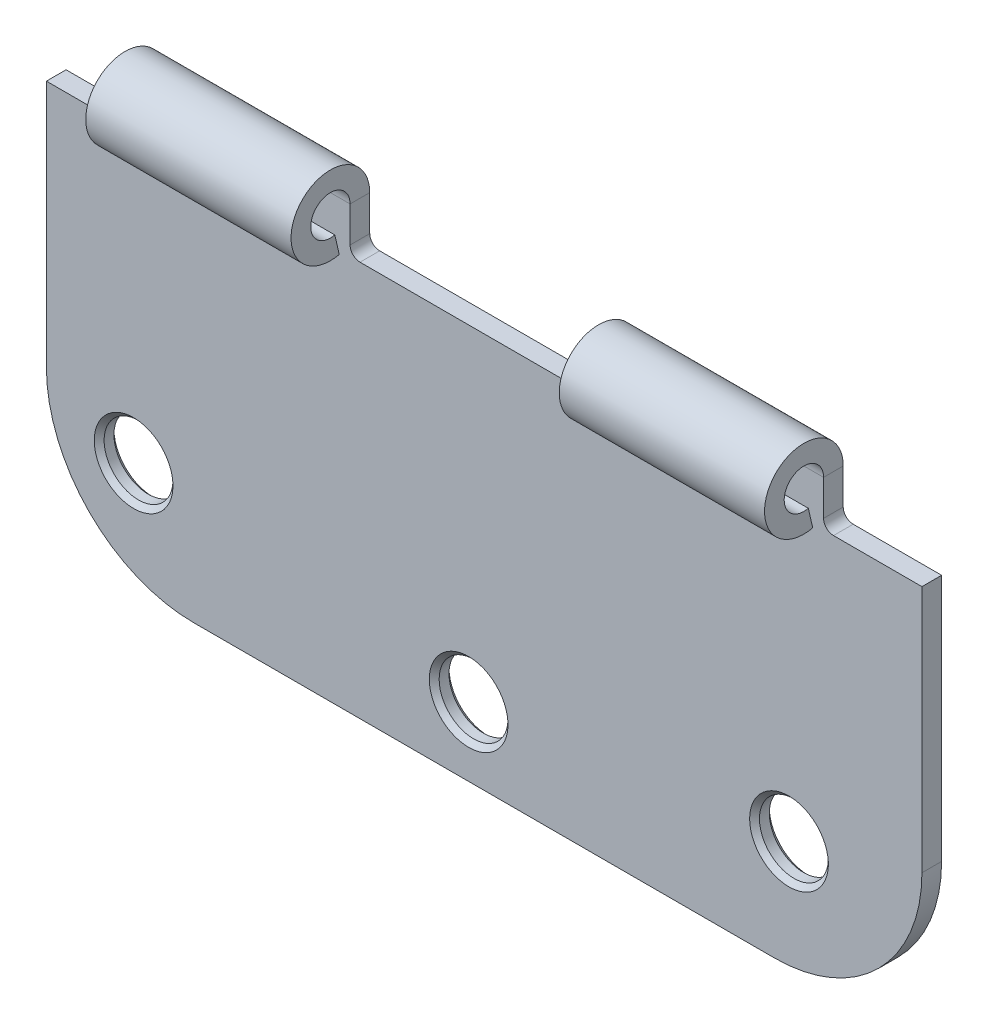
ISO-10303-21;
HEADER;
FILE_DESCRIPTION(('STEP AP214'),'2;1');
FILE_NAME('part.step','',(''),(''),'','','');
FILE_SCHEMA(('AUTOMOTIVE_DESIGN { 1 0 10303 214 1 1 1 1 }'));
ENDSEC;
DATA;
#1=APPLICATION_CONTEXT('core data for automotive mechanical design processes');
#2=APPLICATION_PROTOCOL_DEFINITION('international standard','automotive_design',2000,#1);
#3=PRODUCT_CONTEXT('',#1,'mechanical');
#4=PRODUCT('Part','Part','',(#3));
#5=PRODUCT_RELATED_PRODUCT_CATEGORY('part','',(#4));
#6=PRODUCT_DEFINITION_FORMATION('','',#4);
#7=PRODUCT_DEFINITION_CONTEXT('part definition',#1,'design');
#8=PRODUCT_DEFINITION('design','',#6,#7);
#9=PRODUCT_DEFINITION_SHAPE('','',#8);
#10=(LENGTH_UNIT() NAMED_UNIT(*) SI_UNIT(.MILLI.,.METRE.));
#11=(NAMED_UNIT(*) PLANE_ANGLE_UNIT() SI_UNIT($,.RADIAN.));
#12=(NAMED_UNIT(*) SI_UNIT($,.STERADIAN.) SOLID_ANGLE_UNIT());
#13=UNCERTAINTY_MEASURE_WITH_UNIT(LENGTH_MEASURE(1.E-05),#10,'distance_accuracy_value','');
#14=(GEOMETRIC_REPRESENTATION_CONTEXT(3) GLOBAL_UNCERTAINTY_ASSIGNED_CONTEXT((#13)) GLOBAL_UNIT_ASSIGNED_CONTEXT((#10,
#11,#12)) REPRESENTATION_CONTEXT('',''));
#15=CARTESIAN_POINT('',(0.,0.,0.));
#16=DIRECTION('',(0.,0.,1.));
#17=DIRECTION('',(1.,0.,0.));
#18=AXIS2_PLACEMENT_3D('',#15,#16,#17);
#19=CARTESIAN_POINT('',(58.13069714124,48.81,2.));
#20=DIRECTION('',(1.,0.,0.));
#21=DIRECTION('',(0.,-1.,0.));
#22=AXIS2_PLACEMENT_3D('',#19,#20,#21);
#23=PLANE('',#22);
#24=DIRECTION('',(0.,1.,0.));
#25=VECTOR('',#24,1.);
#26=CARTESIAN_POINT('',(58.13069714124,0.,0.));
#27=LINE('',#26,#25);
#28=CARTESIAN_POINT('',(58.13069714124,44.81,0.));
#29=VERTEX_POINT('',#28);
#30=CARTESIAN_POINT('',(58.13069714124,41.2,0.));
#31=VERTEX_POINT('',#30);
#32=EDGE_CURVE('E208',#29,#31,#27,.F.);
#33=ORIENTED_EDGE('',*,*,#32,.T.);
#34=DIRECTION('',(0.,0.,-1.));
#35=VECTOR('',#34,1.);
#36=CARTESIAN_POINT('',(58.13069714124,41.2,2.));
#37=LINE('',#36,#35);
#38=CARTESIAN_POINT('',(58.13069714124,41.2,2.));
#39=VERTEX_POINT('',#38);
#40=EDGE_CURVE('E366',#31,#39,#37,.F.);
#41=ORIENTED_EDGE('',*,*,#40,.T.);
#42=DIRECTION('',(0.,-1.,0.));
#43=VECTOR('',#42,1.);
#44=CARTESIAN_POINT('',(58.13069714124,48.81,2.));
#45=LINE('',#44,#43);
#46=CARTESIAN_POINT('',(58.13069714124,44.81,2.));
#47=VERTEX_POINT('',#46);
#48=EDGE_CURVE('E307',#47,#39,#45,.T.);
#49=ORIENTED_EDGE('',*,*,#48,.F.);
#50=DIRECTION('',(0.,0.,-1.));
#51=VECTOR('',#50,1.);
#52=CARTESIAN_POINT('',(58.13069714124,44.81,2.));
#53=LINE('',#52,#51);
#54=EDGE_CURVE('E220',#47,#29,#53,.T.);
#55=ORIENTED_EDGE('',*,*,#54,.T.);
#56=EDGE_LOOP('',(#33,#41,#49,#55));
#57=FACE_BOUND('',#56,.T.);
#58=ADVANCED_FACE('F48',(#57),#23,.F.);
#59=CARTESIAN_POINT('',(10.,40.19,2.));
#60=DIRECTION('',(1.,0.,0.));
#61=DIRECTION('',(0.,-1.,0.));
#62=AXIS2_PLACEMENT_3D('',#59,#60,#61);
#63=PLANE('',#62);
#64=DIRECTION('',(0.,1.,0.));
#65=VECTOR('',#64,1.);
#66=CARTESIAN_POINT('',(10.,0.,0.));
#67=LINE('',#66,#65);
#68=CARTESIAN_POINT('',(10.,44.81,0.));
#69=VERTEX_POINT('',#68);
#70=CARTESIAN_POINT('',(10.,41.2,0.));
#71=VERTEX_POINT('',#70);
#72=EDGE_CURVE('E285',#69,#71,#67,.F.);
#73=ORIENTED_EDGE('',*,*,#72,.T.);
#74=DIRECTION('',(0.,0.,-1.));
#75=VECTOR('',#74,1.);
#76=CARTESIAN_POINT('',(10.,41.2,2.));
#77=LINE('',#76,#75);
#78=CARTESIAN_POINT('',(10.,41.2,2.));
#79=VERTEX_POINT('',#78);
#80=EDGE_CURVE('E361',#71,#79,#77,.F.);
#81=ORIENTED_EDGE('',*,*,#80,.T.);
#82=DIRECTION('',(0.,-1.,0.));
#83=VECTOR('',#82,1.);
#84=CARTESIAN_POINT('',(10.,40.19,2.));
#85=LINE('',#84,#83);
#86=CARTESIAN_POINT('',(10.,44.81,2.));
#87=VERTEX_POINT('',#86);
#88=EDGE_CURVE('E288',#87,#79,#85,.T.);
#89=ORIENTED_EDGE('',*,*,#88,.F.);
#90=DIRECTION('',(0.,0.,-1.));
#91=VECTOR('',#90,1.);
#92=CARTESIAN_POINT('',(10.,44.81,2.));
#93=LINE('',#92,#91);
#94=EDGE_CURVE('E262',#87,#69,#93,.T.);
#95=ORIENTED_EDGE('',*,*,#94,.T.);
#96=EDGE_LOOP('',(#73,#81,#89,#95));
#97=FACE_BOUND('',#96,.T.);
#98=ADVANCED_FACE('F448',(#97),#63,.F.);
#99=CARTESIAN_POINT('',(0.,40.19,2.));
#100=DIRECTION('',(1.,0.,0.));
#101=DIRECTION('',(0.,-1.,0.));
#102=AXIS2_PLACEMENT_3D('',#99,#100,#101);
#103=PLANE('',#102);
#104=DIRECTION('',(0.,1.,0.));
#105=VECTOR('',#104,1.);
#106=CARTESIAN_POINT('',(0.,0.,0.));
#107=LINE('',#106,#105);
#108=CARTESIAN_POINT('',(0.,40.19,0.));
#109=VERTEX_POINT('',#108);
#110=CARTESIAN_POINT('',(0.,15.,0.));
#111=VERTEX_POINT('',#110);
#112=EDGE_CURVE('E330',#109,#111,#107,.F.);
#113=ORIENTED_EDGE('',*,*,#112,.T.);
#114=DIRECTION('',(0.,0.,-1.));
#115=VECTOR('',#114,1.);
#116=CARTESIAN_POINT('',(0.,15.,2.));
#117=LINE('',#116,#115);
#118=CARTESIAN_POINT('',(0.,15.,2.));
#119=VERTEX_POINT('',#118);
#120=EDGE_CURVE('E354',#111,#119,#117,.F.);
#121=ORIENTED_EDGE('',*,*,#120,.T.);
#122=DIRECTION('',(0.,-1.,0.));
#123=VECTOR('',#122,1.);
#124=CARTESIAN_POINT('',(0.,40.19,2.));
#125=LINE('',#124,#123);
#126=CARTESIAN_POINT('',(0.,40.19,2.));
#127=VERTEX_POINT('',#126);
#128=EDGE_CURVE('E294',#127,#119,#125,.T.);
#129=ORIENTED_EDGE('',*,*,#128,.F.);
#130=DIRECTION('',(0.,0.,1.));
#131=VECTOR('',#130,1.);
#132=CARTESIAN_POINT('',(0.,40.19,2.));
#133=LINE('',#132,#131);
#134=EDGE_CURVE('E336',#109,#127,#133,.T.);
#135=ORIENTED_EDGE('',*,*,#134,.F.);
#136=EDGE_LOOP('',(#113,#121,#129,#135));
#137=FACE_BOUND('',#136,.T.);
#138=ADVANCED_FACE('F455',(#137),#103,.F.);
#139=CARTESIAN_POINT('',(0.,0.,2.));
#140=DIRECTION('',(0.,1.,0.));
#141=DIRECTION('',(1.,0.,0.));
#142=AXIS2_PLACEMENT_3D('',#139,#140,#141);
#143=PLANE('',#142);
#144=DIRECTION('',(-1.,0.,0.));
#145=VECTOR('',#144,1.);
#146=CARTESIAN_POINT('',(0.,0.,0.));
#147=LINE('',#146,#145);
#148=CARTESIAN_POINT('',(15.,0.,0.));
#149=VERTEX_POINT('',#148);
#150=CARTESIAN_POINT('',(74.,0.,0.));
#151=VERTEX_POINT('',#150);
#152=EDGE_CURVE('E327',#149,#151,#147,.F.);
#153=ORIENTED_EDGE('',*,*,#152,.T.);
#154=DIRECTION('',(0.,0.,-1.));
#155=VECTOR('',#154,1.);
#156=CARTESIAN_POINT('',(74.,0.,2.));
#157=LINE('',#156,#155);
#158=CARTESIAN_POINT('',(74.,0.,2.));
#159=VERTEX_POINT('',#158);
#160=EDGE_CURVE('E341',#151,#159,#157,.F.);
#161=ORIENTED_EDGE('',*,*,#160,.T.);
#162=DIRECTION('',(1.,0.,0.));
#163=VECTOR('',#162,1.);
#164=CARTESIAN_POINT('',(0.,0.,2.));
#165=LINE('',#164,#163);
#166=CARTESIAN_POINT('',(15.,0.,2.));
#167=VERTEX_POINT('',#166);
#168=EDGE_CURVE('E297',#167,#159,#165,.T.);
#169=ORIENTED_EDGE('',*,*,#168,.F.);
#170=DIRECTION('',(0.,0.,-1.));
#171=VECTOR('',#170,1.);
#172=CARTESIAN_POINT('',(15.,0.,2.));
#173=LINE('',#172,#171);
#174=EDGE_CURVE('E339',#167,#149,#173,.T.);
#175=ORIENTED_EDGE('',*,*,#174,.T.);
#176=EDGE_LOOP('',(#153,#161,#169,#175));
#177=FACE_BOUND('',#176,.T.);
#178=ADVANCED_FACE('F470',(#177),#143,.F.);
#179=CARTESIAN_POINT('',(89.,40.19,2.));
#180=DIRECTION('',(-1.,0.,0.));
#181=DIRECTION('',(0.,1.,0.));
#182=AXIS2_PLACEMENT_3D('',#179,#180,#181);
#183=PLANE('',#182);
#184=DIRECTION('',(0.,1.,0.));
#185=VECTOR('',#184,1.);
#186=CARTESIAN_POINT('',(89.,40.19,2.));
#187=LINE('',#186,#185);
#188=CARTESIAN_POINT('',(89.,15.,2.));
#189=VERTEX_POINT('',#188);
#190=CARTESIAN_POINT('',(89.,40.19,2.));
#191=VERTEX_POINT('',#190);
#192=EDGE_CURVE('E300',#189,#191,#187,.T.);
#193=ORIENTED_EDGE('',*,*,#192,.F.);
#194=DIRECTION('',(0.,0.,-1.));
#195=VECTOR('',#194,1.);
#196=CARTESIAN_POINT('',(89.,15.,2.));
#197=LINE('',#196,#195);
#198=CARTESIAN_POINT('',(89.,15.,0.));
#199=VERTEX_POINT('',#198);
#200=EDGE_CURVE('E348',#189,#199,#197,.T.);
#201=ORIENTED_EDGE('',*,*,#200,.T.);
#202=DIRECTION('',(0.,1.,0.));
#203=VECTOR('',#202,1.);
#204=CARTESIAN_POINT('',(89.,0.,0.));
#205=LINE('',#204,#203);
#206=CARTESIAN_POINT('',(89.,40.19,0.));
#207=VERTEX_POINT('',#206);
#208=EDGE_CURVE('E325',#199,#207,#205,.T.);
#209=ORIENTED_EDGE('',*,*,#208,.T.);
#210=DIRECTION('',(0.,0.,1.));
#211=VECTOR('',#210,1.);
#212=CARTESIAN_POINT('',(89.,40.19,2.));
#213=LINE('',#212,#211);
#214=EDGE_CURVE('E314',#207,#191,#213,.T.);
#215=ORIENTED_EDGE('',*,*,#214,.T.);
#216=EDGE_LOOP('',(#193,#201,#209,#215));
#217=FACE_BOUND('',#216,.T.);
#218=ADVANCED_FACE('F466',(#217),#183,.F.);
#219=CARTESIAN_POINT('',(79.,40.19,2.));
#220=DIRECTION('',(0.,-1.,0.));
#221=DIRECTION('',(-1.,0.,0.));
#222=AXIS2_PLACEMENT_3D('',#219,#220,#221);
#223=PLANE('',#222);
#224=DIRECTION('',(-1.,0.,0.));
#225=VECTOR('',#224,1.);
#226=CARTESIAN_POINT('',(0.,40.19,0.));
#227=LINE('',#226,#225);
#228=CARTESIAN_POINT('',(80.01,40.19,0.));
#229=VERTEX_POINT('',#228);
#230=EDGE_CURVE('E209',#207,#229,#227,.T.);
#231=ORIENTED_EDGE('',*,*,#230,.T.);
#232=DIRECTION('',(0.,0.,-1.));
#233=VECTOR('',#232,1.);
#234=CARTESIAN_POINT('',(80.01,40.19,2.));
#235=LINE('',#234,#233);
#236=CARTESIAN_POINT('',(80.01,40.19,2.));
#237=VERTEX_POINT('',#236);
#238=EDGE_CURVE('E357',#229,#237,#235,.F.);
#239=ORIENTED_EDGE('',*,*,#238,.T.);
#240=DIRECTION('',(-1.,0.,0.));
#241=VECTOR('',#240,1.);
#242=CARTESIAN_POINT('',(79.,40.19,2.));
#243=LINE('',#242,#241);
#244=EDGE_CURVE('E302',#191,#237,#243,.T.);
#245=ORIENTED_EDGE('',*,*,#244,.F.);
#246=ORIENTED_EDGE('',*,*,#214,.F.);
#247=EDGE_LOOP('',(#231,#239,#245,#246));
#248=FACE_BOUND('',#247,.T.);
#249=ADVANCED_FACE('F463',(#248),#223,.F.);
#250=CARTESIAN_POINT('',(79.,40.19,2.));
#251=DIRECTION('',(-1.,0.,0.));
#252=DIRECTION('',(0.,1.,0.));
#253=AXIS2_PLACEMENT_3D('',#250,#251,#252);
#254=PLANE('',#253);
#255=DIRECTION('',(0.,1.,0.));
#256=VECTOR('',#255,1.);
#257=CARTESIAN_POINT('',(79.,40.19,2.));
#258=LINE('',#257,#256);
#259=CARTESIAN_POINT('',(79.,41.2,2.));
#260=VERTEX_POINT('',#259);
#261=CARTESIAN_POINT('',(79.,44.81,2.));
#262=VERTEX_POINT('',#261);
#263=EDGE_CURVE('E305',#260,#262,#258,.T.);
#264=ORIENTED_EDGE('',*,*,#263,.F.);
#265=DIRECTION('',(0.,0.,-1.));
#266=VECTOR('',#265,1.);
#267=CARTESIAN_POINT('',(79.,41.2,0.));
#268=LINE('',#267,#266);
#269=CARTESIAN_POINT('',(79.,41.2,0.));
#270=VERTEX_POINT('',#269);
#271=EDGE_CURVE('E204',#260,#270,#268,.T.);
#272=ORIENTED_EDGE('',*,*,#271,.T.);
#273=DIRECTION('',(0.,1.,0.));
#274=VECTOR('',#273,1.);
#275=CARTESIAN_POINT('',(79.,0.,0.));
#276=LINE('',#275,#274);
#277=CARTESIAN_POINT('',(79.,44.81,0.));
#278=VERTEX_POINT('',#277);
#279=EDGE_CURVE('E198',#270,#278,#276,.T.);
#280=ORIENTED_EDGE('',*,*,#279,.T.);
#281=DIRECTION('',(0.,0.,-1.));
#282=VECTOR('',#281,1.);
#283=CARTESIAN_POINT('',(79.,44.81,2.));
#284=LINE('',#283,#282);
#285=EDGE_CURVE('E202',#262,#278,#284,.T.);
#286=ORIENTED_EDGE('',*,*,#285,.F.);
#287=EDGE_LOOP('',(#264,#272,#280,#286));
#288=FACE_BOUND('',#287,.T.);
#289=ADVANCED_FACE('F201',(#288),#254,.F.);
#290=CARTESIAN_POINT('',(58.13069714124,40.19,2.));
#291=DIRECTION('',(0.,-1.,0.));
#292=DIRECTION('',(-1.,0.,0.));
#293=AXIS2_PLACEMENT_3D('',#290,#291,#292);
#294=PLANE('',#293);
#295=DIRECTION('',(-1.,0.,0.));
#296=VECTOR('',#295,1.);
#297=CARTESIAN_POINT('',(58.13069714124,40.19,2.));
#298=LINE('',#297,#296);
#299=CARTESIAN_POINT('',(57.12069714124,40.19,2.));
#300=VERTEX_POINT('',#299);
#301=CARTESIAN_POINT('',(31.87930285876,40.19,2.));
#302=VERTEX_POINT('',#301);
#303=EDGE_CURVE('E310',#300,#302,#298,.T.);
#304=ORIENTED_EDGE('',*,*,#303,.F.);
#305=DIRECTION('',(0.,0.,-1.));
#306=VECTOR('',#305,1.);
#307=CARTESIAN_POINT('',(57.12069714124,40.19,0.));
#308=LINE('',#307,#306);
#309=CARTESIAN_POINT('',(57.12069714124,40.19,0.));
#310=VERTEX_POINT('',#309);
#311=EDGE_CURVE('E372',#300,#310,#308,.T.);
#312=ORIENTED_EDGE('',*,*,#311,.T.);
#313=DIRECTION('',(-1.,0.,0.));
#314=VECTOR('',#313,1.);
#315=CARTESIAN_POINT('',(0.,40.19,0.));
#316=LINE('',#315,#314);
#317=CARTESIAN_POINT('',(31.87930285876,40.19,0.));
#318=VERTEX_POINT('',#317);
#319=EDGE_CURVE('E319',#310,#318,#316,.T.);
#320=ORIENTED_EDGE('',*,*,#319,.T.);
#321=DIRECTION('',(0.,0.,-1.));
#322=VECTOR('',#321,1.);
#323=CARTESIAN_POINT('',(31.87930285876,40.19,2.));
#324=LINE('',#323,#322);
#325=EDGE_CURVE('E369',#318,#302,#324,.F.);
#326=ORIENTED_EDGE('',*,*,#325,.T.);
#327=EDGE_LOOP('',(#304,#312,#320,#326));
#328=FACE_BOUND('',#327,.T.);
#329=ADVANCED_FACE('F459',(#328),#294,.F.);
#330=CARTESIAN_POINT('',(30.86930285876,48.81,2.));
#331=DIRECTION('',(-1.,0.,0.));
#332=DIRECTION('',(0.,1.,0.));
#333=AXIS2_PLACEMENT_3D('',#330,#331,#332);
#334=PLANE('',#333);
#335=DIRECTION('',(0.,1.,0.));
#336=VECTOR('',#335,1.);
#337=CARTESIAN_POINT('',(30.86930285876,48.81,2.));
#338=LINE('',#337,#336);
#339=CARTESIAN_POINT('',(30.86930285876,41.2,2.));
#340=VERTEX_POINT('',#339);
#341=CARTESIAN_POINT('',(30.86930285876,44.81,2.));
#342=VERTEX_POINT('',#341);
#343=EDGE_CURVE('E312',#340,#342,#338,.T.);
#344=ORIENTED_EDGE('',*,*,#343,.F.);
#345=DIRECTION('',(0.,0.,-1.));
#346=VECTOR('',#345,1.);
#347=CARTESIAN_POINT('',(30.86930285876,41.2,0.));
#348=LINE('',#347,#346);
#349=CARTESIAN_POINT('',(30.86930285876,41.2,0.));
#350=VERTEX_POINT('',#349);
#351=EDGE_CURVE('E64',#340,#350,#348,.T.);
#352=ORIENTED_EDGE('',*,*,#351,.T.);
#353=DIRECTION('',(0.,1.,0.));
#354=VECTOR('',#353,1.);
#355=CARTESIAN_POINT('',(30.86930285876,0.,0.));
#356=LINE('',#355,#354);
#357=CARTESIAN_POINT('',(30.86930285876,44.81,0.));
#358=VERTEX_POINT('',#357);
#359=EDGE_CURVE('E292',#350,#358,#356,.T.);
#360=ORIENTED_EDGE('',*,*,#359,.T.);
#361=DIRECTION('',(0.,0.,-1.));
#362=VECTOR('',#361,1.);
#363=CARTESIAN_POINT('',(30.86930285876,44.81,2.));
#364=LINE('',#363,#362);
#365=EDGE_CURVE('E278',#342,#358,#364,.T.);
#366=ORIENTED_EDGE('',*,*,#365,.F.);
#367=EDGE_LOOP('',(#344,#352,#360,#366));
#368=FACE_BOUND('',#367,.T.);
#369=ADVANCED_FACE('F480',(#368),#334,.F.);
#370=CARTESIAN_POINT('',(10.,40.19,2.));
#371=DIRECTION('',(0.,-1.,0.));
#372=DIRECTION('',(-1.,0.,0.));
#373=AXIS2_PLACEMENT_3D('',#370,#371,#372);
#374=PLANE('',#373);
#375=DIRECTION('',(-1.,0.,0.));
#376=VECTOR('',#375,1.);
#377=CARTESIAN_POINT('',(10.,40.19,2.));
#378=LINE('',#377,#376);
#379=CARTESIAN_POINT('',(8.99,40.19,2.));
#380=VERTEX_POINT('',#379);
#381=EDGE_CURVE('E291',#380,#127,#378,.T.);
#382=ORIENTED_EDGE('',*,*,#381,.F.);
#383=DIRECTION('',(0.,0.,-1.));
#384=VECTOR('',#383,1.);
#385=CARTESIAN_POINT('',(8.99,40.19,0.));
#386=LINE('',#385,#384);
#387=CARTESIAN_POINT('',(8.99,40.19,0.));
#388=VERTEX_POINT('',#387);
#389=EDGE_CURVE('E364',#380,#388,#386,.T.);
#390=ORIENTED_EDGE('',*,*,#389,.T.);
#391=DIRECTION('',(-1.,0.,0.));
#392=VECTOR('',#391,1.);
#393=CARTESIAN_POINT('',(0.,40.19,0.));
#394=LINE('',#393,#392);
#395=EDGE_CURVE('E317',#388,#109,#394,.T.);
#396=ORIENTED_EDGE('',*,*,#395,.T.);
#397=ORIENTED_EDGE('',*,*,#134,.T.);
#398=EDGE_LOOP('',(#382,#390,#396,#397));
#399=FACE_BOUND('',#398,.T.);
#400=ADVANCED_FACE('F442',(#399),#374,.F.);
#401=CARTESIAN_POINT('',(0.,0.,2.));
#402=DIRECTION('',(0.,0.,-1.));
#403=DIRECTION('',(-1.,0.,0.));
#404=AXIS2_PLACEMENT_3D('',#401,#402,#403);
#405=PLANE('',#404);
#406=CARTESIAN_POINT('',(75.4859914365811,11.,2.));
#407=DIRECTION('',(0.,0.,-1.));
#408=DIRECTION('',(-1.,0.,0.));
#409=AXIS2_PLACEMENT_3D('',#406,#407,#408);
#410=CIRCLE('',#409,3.99999999999999);
#411=CARTESIAN_POINT('',(71.4859914365811,11.,2.));
#412=VERTEX_POINT('',#411);
#413=EDGE_CURVE('E402',#412,#412,#410,.T.);
#414=ORIENTED_EDGE('',*,*,#413,.T.);
#415=EDGE_LOOP('',(#414));
#416=FACE_BOUND('',#415,.T.);
#417=CARTESIAN_POINT('',(42.9246166489975,7.,2.));
#418=DIRECTION('',(0.,0.,-1.));
#419=DIRECTION('',(-1.,0.,0.));
#420=AXIS2_PLACEMENT_3D('',#417,#418,#419);
#421=CIRCLE('',#420,3.99999999999999);
#422=CARTESIAN_POINT('',(38.9246166489975,7.,2.));
#423=VERTEX_POINT('',#422);
#424=EDGE_CURVE('E399',#423,#423,#421,.T.);
#425=ORIENTED_EDGE('',*,*,#424,.T.);
#426=EDGE_LOOP('',(#425));
#427=FACE_BOUND('',#426,.T.);
#428=CARTESIAN_POINT('',(8.86598584606513,11.,2.));
#429=DIRECTION('',(0.,0.,-1.));
#430=DIRECTION('',(-1.,0.,0.));
#431=AXIS2_PLACEMENT_3D('',#428,#429,#430);
#432=CIRCLE('',#431,4.);
#433=CARTESIAN_POINT('',(4.86598584606513,11.,2.));
#434=VERTEX_POINT('',#433);
#435=EDGE_CURVE('E396',#434,#434,#432,.T.);
#436=ORIENTED_EDGE('',*,*,#435,.T.);
#437=EDGE_LOOP('',(#436));
#438=FACE_BOUND('',#437,.T.);
#439=ORIENTED_EDGE('',*,*,#168,.T.);
#440=CARTESIAN_POINT('',(74.,15.,2.));
#441=DIRECTION('',(0.,0.,-1.));
#442=DIRECTION('',(-1.,0.,0.));
#443=AXIS2_PLACEMENT_3D('',#440,#441,#442);
#444=CIRCLE('',#443,15.);
#445=EDGE_CURVE('E346',#159,#189,#444,.F.);
#446=ORIENTED_EDGE('',*,*,#445,.T.);
#447=ORIENTED_EDGE('',*,*,#192,.T.);
#448=ORIENTED_EDGE('',*,*,#244,.T.);
#449=CARTESIAN_POINT('',(80.01,41.2,2.));
#450=DIRECTION('',(0.,0.,-1.));
#451=DIRECTION('',(-1.,0.,0.));
#452=AXIS2_PLACEMENT_3D('',#449,#450,#451);
#453=CIRCLE('',#452,1.01);
#454=EDGE_CURVE('E375',#237,#260,#453,.T.);
#455=ORIENTED_EDGE('',*,*,#454,.T.);
#456=ORIENTED_EDGE('',*,*,#263,.T.);
#457=DIRECTION('',(-1.,0.,0.));
#458=VECTOR('',#457,1.);
#459=CARTESIAN_POINT('',(58.13069714124,44.81,2.));
#460=LINE('',#459,#458);
#461=EDGE_CURVE('E242',#47,#262,#460,.F.);
#462=ORIENTED_EDGE('',*,*,#461,.F.);
#463=ORIENTED_EDGE('',*,*,#48,.T.);
#464=CARTESIAN_POINT('',(57.12069714124,41.2,2.));
#465=DIRECTION('',(0.,0.,-1.));
#466=DIRECTION('',(-1.,0.,0.));
#467=AXIS2_PLACEMENT_3D('',#464,#465,#466);
#468=CIRCLE('',#467,1.01);
#469=EDGE_CURVE('E383',#39,#300,#468,.T.);
#470=ORIENTED_EDGE('',*,*,#469,.T.);
#471=ORIENTED_EDGE('',*,*,#303,.T.);
#472=CARTESIAN_POINT('',(31.87930285876,41.2,2.));
#473=DIRECTION('',(0.,0.,-1.));
#474=DIRECTION('',(-1.,0.,0.));
#475=AXIS2_PLACEMENT_3D('',#472,#473,#474);
#476=CIRCLE('',#475,1.01);
#477=EDGE_CURVE('E72',#302,#340,#476,.T.);
#478=ORIENTED_EDGE('',*,*,#477,.T.);
#479=ORIENTED_EDGE('',*,*,#343,.T.);
#480=DIRECTION('',(-1.,0.,0.));
#481=VECTOR('',#480,1.);
#482=CARTESIAN_POINT('',(9.99999999999999,44.81,2.));
#483=LINE('',#482,#481);
#484=EDGE_CURVE('E271',#87,#342,#483,.F.);
#485=ORIENTED_EDGE('',*,*,#484,.F.);
#486=ORIENTED_EDGE('',*,*,#88,.T.);
#487=CARTESIAN_POINT('',(8.99,41.2,2.));
#488=DIRECTION('',(0.,0.,-1.));
#489=DIRECTION('',(-1.,0.,0.));
#490=AXIS2_PLACEMENT_3D('',#487,#488,#489);
#491=CIRCLE('',#490,1.01);
#492=EDGE_CURVE('E379',#79,#380,#491,.T.);
#493=ORIENTED_EDGE('',*,*,#492,.T.);
#494=ORIENTED_EDGE('',*,*,#381,.T.);
#495=ORIENTED_EDGE('',*,*,#128,.T.);
#496=CARTESIAN_POINT('',(15.,15.,2.));
#497=DIRECTION('',(0.,0.,-1.));
#498=DIRECTION('',(-1.,0.,0.));
#499=AXIS2_PLACEMENT_3D('',#496,#497,#498);
#500=CIRCLE('',#499,15.);
#501=EDGE_CURVE('E344',#119,#167,#500,.F.);
#502=ORIENTED_EDGE('',*,*,#501,.T.);
#503=EDGE_LOOP('',(#439,#446,#447,#448,#455,#456,#462,#463,#470,#471,#478,#479,#485,#486,#493,
#494,#495,#502));
#504=FACE_BOUND('',#503,.T.);
#505=ADVANCED_FACE('F431',(#416,#427,#438,#504),#405,.F.);
#506=CARTESIAN_POINT('',(0.,0.,0.));
#507=DIRECTION('',(0.,0.,-1.));
#508=DIRECTION('',(-1.,0.,0.));
#509=AXIS2_PLACEMENT_3D('',#506,#507,#508);
#510=PLANE('',#509);
#511=CARTESIAN_POINT('',(75.4859914365811,11.,0.));
#512=DIRECTION('',(0.,0.,-1.));
#513=DIRECTION('',(-1.,0.,0.));
#514=AXIS2_PLACEMENT_3D('',#511,#512,#513);
#515=CIRCLE('',#514,4.00000000000003);
#516=CARTESIAN_POINT('',(71.4859914365811,11.,0.));
#517=VERTEX_POINT('',#516);
#518=EDGE_CURVE('E411',#517,#517,#515,.F.);
#519=ORIENTED_EDGE('',*,*,#518,.T.);
#520=EDGE_LOOP('',(#519));
#521=FACE_BOUND('',#520,.T.);
#522=CARTESIAN_POINT('',(42.9246166489975,7.,0.));
#523=DIRECTION('',(0.,0.,-1.));
#524=DIRECTION('',(-1.,0.,0.));
#525=AXIS2_PLACEMENT_3D('',#522,#523,#524);
#526=CIRCLE('',#525,4.00000000000003);
#527=CARTESIAN_POINT('',(38.9246166489975,7.,0.));
#528=VERTEX_POINT('',#527);
#529=EDGE_CURVE('E408',#528,#528,#526,.F.);
#530=ORIENTED_EDGE('',*,*,#529,.T.);
#531=EDGE_LOOP('',(#530));
#532=FACE_BOUND('',#531,.T.);
#533=CARTESIAN_POINT('',(8.86598584606513,11.,0.));
#534=DIRECTION('',(0.,0.,-1.));
#535=DIRECTION('',(-1.,0.,0.));
#536=AXIS2_PLACEMENT_3D('',#533,#534,#535);
#537=CIRCLE('',#536,3.99999999999999);
#538=CARTESIAN_POINT('',(4.86598584606514,11.,0.));
#539=VERTEX_POINT('',#538);
#540=EDGE_CURVE('E405',#539,#539,#537,.F.);
#541=ORIENTED_EDGE('',*,*,#540,.T.);
#542=EDGE_LOOP('',(#541));
#543=FACE_BOUND('',#542,.T.);
#544=ORIENTED_EDGE('',*,*,#208,.F.);
#545=CARTESIAN_POINT('',(74.,15.,0.));
#546=DIRECTION('',(0.,0.,-1.));
#547=DIRECTION('',(-1.,0.,0.));
#548=AXIS2_PLACEMENT_3D('',#545,#546,#547);
#549=CIRCLE('',#548,15.);
#550=EDGE_CURVE('E352',#199,#151,#549,.T.);
#551=ORIENTED_EDGE('',*,*,#550,.T.);
#552=ORIENTED_EDGE('',*,*,#152,.F.);
#553=CARTESIAN_POINT('',(15.,15.,0.));
#554=DIRECTION('',(0.,0.,-1.));
#555=DIRECTION('',(-1.,0.,0.));
#556=AXIS2_PLACEMENT_3D('',#553,#554,#555);
#557=CIRCLE('',#556,15.);
#558=EDGE_CURVE('E350',#149,#111,#557,.T.);
#559=ORIENTED_EDGE('',*,*,#558,.T.);
#560=ORIENTED_EDGE('',*,*,#112,.F.);
#561=ORIENTED_EDGE('',*,*,#395,.F.);
#562=CARTESIAN_POINT('',(8.99,41.2,0.));
#563=DIRECTION('',(0.,0.,-1.));
#564=DIRECTION('',(-1.,0.,0.));
#565=AXIS2_PLACEMENT_3D('',#562,#563,#564);
#566=CIRCLE('',#565,1.01);
#567=EDGE_CURVE('E381',#388,#71,#566,.F.);
#568=ORIENTED_EDGE('',*,*,#567,.T.);
#569=ORIENTED_EDGE('',*,*,#72,.F.);
#570=DIRECTION('',(-1.,0.,0.));
#571=VECTOR('',#570,1.);
#572=CARTESIAN_POINT('',(9.99999999999999,44.81,0.));
#573=LINE('',#572,#571);
#574=EDGE_CURVE('E255',#69,#358,#573,.F.);
#575=ORIENTED_EDGE('',*,*,#574,.T.);
#576=ORIENTED_EDGE('',*,*,#359,.F.);
#577=CARTESIAN_POINT('',(31.87930285876,41.2,0.));
#578=DIRECTION('',(0.,0.,-1.));
#579=DIRECTION('',(-1.,0.,0.));
#580=AXIS2_PLACEMENT_3D('',#577,#578,#579);
#581=CIRCLE('',#580,1.01);
#582=EDGE_CURVE('E388',#350,#318,#581,.F.);
#583=ORIENTED_EDGE('',*,*,#582,.T.);
#584=ORIENTED_EDGE('',*,*,#319,.F.);
#585=CARTESIAN_POINT('',(57.12069714124,41.2,0.));
#586=DIRECTION('',(0.,0.,-1.));
#587=DIRECTION('',(-1.,0.,0.));
#588=AXIS2_PLACEMENT_3D('',#585,#586,#587);
#589=CIRCLE('',#588,1.01);
#590=EDGE_CURVE('E385',#310,#31,#589,.F.);
#591=ORIENTED_EDGE('',*,*,#590,.T.);
#592=ORIENTED_EDGE('',*,*,#32,.F.);
#593=DIRECTION('',(-1.,0.,0.));
#594=VECTOR('',#593,1.);
#595=CARTESIAN_POINT('',(58.13069714124,44.81,0.));
#596=LINE('',#595,#594);
#597=EDGE_CURVE('E226',#29,#278,#596,.F.);
#598=ORIENTED_EDGE('',*,*,#597,.T.);
#599=ORIENTED_EDGE('',*,*,#279,.F.);
#600=CARTESIAN_POINT('',(80.01,41.2,0.));
#601=DIRECTION('',(0.,0.,-1.));
#602=DIRECTION('',(-1.,0.,0.));
#603=AXIS2_PLACEMENT_3D('',#600,#601,#602);
#604=CIRCLE('',#603,1.01);
#605=EDGE_CURVE('E377',#270,#229,#604,.F.);
#606=ORIENTED_EDGE('',*,*,#605,.T.);
#607=ORIENTED_EDGE('',*,*,#230,.F.);
#608=EDGE_LOOP('',(#544,#551,#552,#559,#560,#561,#568,#569,#575,#576,#583,#584,#591,#592,#598,
#599,#606,#607));
#609=FACE_BOUND('',#608,.T.);
#610=ADVANCED_FACE('F233',(#521,#532,#543,#609),#510,.T.);
#611=CARTESIAN_POINT('',(20.43465142938,42.8612598704295,3.55009789131226));
#612=DIRECTION('',(0.,-0.224951054343872,0.974370064785234));
#613=DIRECTION('',(-1.,0.,0.));
#614=AXIS2_PLACEMENT_3D('',#611,#612,#613);
#615=PLANE('',#614);
#616=DIRECTION('',(0.,-0.974370064785234,-0.224951054343872));
#617=VECTOR('',#616,1.);
#618=CARTESIAN_POINT('',(10.,42.8612598704295,3.55009789131226));
#619=LINE('',#618,#617);
#620=CARTESIAN_POINT('',(10.,42.8612598704295,3.55009789131226));
#621=VERTEX_POINT('',#620);
#622=CARTESIAN_POINT('',(10.,40.9125197408591,3.10019578262451));
#623=VERTEX_POINT('',#622);
#624=EDGE_CURVE('E283',#621,#623,#619,.T.);
#625=ORIENTED_EDGE('',*,*,#624,.F.);
#626=DIRECTION('',(-1.,0.,0.));
#627=VECTOR('',#626,1.);
#628=CARTESIAN_POINT('',(9.99999999999999,42.8612598704295,3.55009789131226));
#629=LINE('',#628,#627);
#630=CARTESIAN_POINT('',(30.86930285876,42.8612598704295,3.55009789131226));
#631=VERTEX_POINT('',#630);
#632=EDGE_CURVE('E253',#631,#621,#629,.T.);
#633=ORIENTED_EDGE('',*,*,#632,.F.);
#634=DIRECTION('',(0.,-0.974370064785234,-0.224951054343872));
#635=VECTOR('',#634,1.);
#636=CARTESIAN_POINT('',(30.86930285876,42.8612598704295,3.55009789131226));
#637=LINE('',#636,#635);
#638=CARTESIAN_POINT('',(30.86930285876,40.9125197408591,3.10019578262451));
#639=VERTEX_POINT('',#638);
#640=EDGE_CURVE('E281',#631,#639,#637,.T.);
#641=ORIENTED_EDGE('',*,*,#640,.T.);
#642=DIRECTION('',(-1.,0.,0.));
#643=VECTOR('',#642,1.);
#644=CARTESIAN_POINT('',(9.99999999999999,40.9125197408591,3.10019578262451));
#645=LINE('',#644,#643);
#646=EDGE_CURVE('E263',#639,#623,#645,.T.);
#647=ORIENTED_EDGE('',*,*,#646,.T.);
#648=EDGE_LOOP('',(#625,#633,#641,#647));
#649=FACE_BOUND('',#648,.T.);
#650=ADVANCED_FACE('F430',(#649),#615,.F.);
#651=CARTESIAN_POINT('',(30.86930285876,44.81,4.));
#652=DIRECTION('',(1.,0.,0.));
#653=DIRECTION('',(0.,0.,-1.));
#654=AXIS2_PLACEMENT_3D('',#651,#652,#653);
#655=PLANE('',#654);
#656=ORIENTED_EDGE('',*,*,#640,.F.);
#657=CARTESIAN_POINT('',(30.86930285876,44.81,4.));
#658=DIRECTION('',(-1.,0.,0.));
#659=DIRECTION('',(0.,0.,1.));
#660=AXIS2_PLACEMENT_3D('',#657,#658,#659);
#661=CIRCLE('',#660,2.);
#662=EDGE_CURVE('E266',#342,#631,#661,.F.);
#663=ORIENTED_EDGE('',*,*,#662,.F.);
#664=ORIENTED_EDGE('',*,*,#365,.T.);
#665=CARTESIAN_POINT('',(30.86930285876,44.81,4.));
#666=DIRECTION('',(-1.,0.,0.));
#667=DIRECTION('',(0.,0.,1.));
#668=AXIS2_PLACEMENT_3D('',#665,#666,#667);
#669=CIRCLE('',#668,4.);
#670=EDGE_CURVE('E258',#358,#639,#669,.F.);
#671=ORIENTED_EDGE('',*,*,#670,.T.);
#672=EDGE_LOOP('',(#656,#663,#664,#671));
#673=FACE_BOUND('',#672,.T.);
#674=ADVANCED_FACE('F439',(#673),#655,.T.);
#675=CARTESIAN_POINT('',(10.,44.81,4.));
#676=DIRECTION('',(1.,0.,0.));
#677=DIRECTION('',(0.,0.,-1.));
#678=AXIS2_PLACEMENT_3D('',#675,#676,#677);
#679=PLANE('',#678);
#680=CARTESIAN_POINT('',(10.,44.81,4.));
#681=DIRECTION('',(-1.,0.,0.));
#682=DIRECTION('',(0.,0.,1.));
#683=AXIS2_PLACEMENT_3D('',#680,#681,#682);
#684=CIRCLE('',#683,2.);
#685=EDGE_CURVE('E274',#621,#87,#684,.T.);
#686=ORIENTED_EDGE('',*,*,#685,.F.);
#687=ORIENTED_EDGE('',*,*,#624,.T.);
#688=CARTESIAN_POINT('',(10.,44.81,4.));
#689=DIRECTION('',(-1.,0.,0.));
#690=DIRECTION('',(0.,0.,1.));
#691=AXIS2_PLACEMENT_3D('',#688,#689,#690);
#692=CIRCLE('',#691,4.);
#693=EDGE_CURVE('E259',#623,#69,#692,.T.);
#694=ORIENTED_EDGE('',*,*,#693,.T.);
#695=ORIENTED_EDGE('',*,*,#94,.F.);
#696=EDGE_LOOP('',(#686,#687,#694,#695));
#697=FACE_BOUND('',#696,.T.);
#698=ADVANCED_FACE('F575',(#697),#679,.F.);
#699=CARTESIAN_POINT('',(9.99999999999999,44.81,4.));
#700=DIRECTION('',(-1.,0.,0.));
#701=DIRECTION('',(0.,-0.974370064785234,-0.224951054343872));
#702=AXIS2_PLACEMENT_3D('',#699,#700,#701);
#703=CYLINDRICAL_SURFACE('',#702,4.);
#704=ORIENTED_EDGE('',*,*,#574,.F.);
#705=ORIENTED_EDGE('',*,*,#693,.F.);
#706=ORIENTED_EDGE('',*,*,#646,.F.);
#707=ORIENTED_EDGE('',*,*,#670,.F.);
#708=EDGE_LOOP('',(#704,#705,#706,#707));
#709=FACE_BOUND('',#708,.T.);
#710=ADVANCED_FACE('F572',(#709),#703,.T.);
#711=CARTESIAN_POINT('',(9.99999999999999,44.81,4.));
#712=DIRECTION('',(-1.,0.,0.));
#713=DIRECTION('',(0.,-0.974370064785234,-0.224951054343872));
#714=AXIS2_PLACEMENT_3D('',#711,#712,#713);
#715=CYLINDRICAL_SURFACE('',#714,2.);
#716=ORIENTED_EDGE('',*,*,#484,.T.);
#717=ORIENTED_EDGE('',*,*,#662,.T.);
#718=ORIENTED_EDGE('',*,*,#632,.T.);
#719=ORIENTED_EDGE('',*,*,#685,.T.);
#720=EDGE_LOOP('',(#716,#717,#718,#719));
#721=FACE_BOUND('',#720,.T.);
#722=ADVANCED_FACE('F567',(#721),#715,.F.);
#723=CARTESIAN_POINT('',(68.56534857062,42.8612598704295,3.55009789131226));
#724=DIRECTION('',(0.,-0.224951054343872,0.974370064785234));
#725=DIRECTION('',(-1.,0.,0.));
#726=AXIS2_PLACEMENT_3D('',#723,#724,#725);
#727=PLANE('',#726);
#728=DIRECTION('',(0.,-0.974370064785234,-0.224951054343872));
#729=VECTOR('',#728,1.);
#730=CARTESIAN_POINT('',(58.13069714124,42.8612598704295,3.55009789131226));
#731=LINE('',#730,#729);
#732=CARTESIAN_POINT('',(58.13069714124,42.8612598704295,3.55009789131226));
#733=VERTEX_POINT('',#732);
#734=CARTESIAN_POINT('',(58.13069714124,40.9125197408591,3.10019578262451));
#735=VERTEX_POINT('',#734);
#736=EDGE_CURVE('E251',#733,#735,#731,.T.);
#737=ORIENTED_EDGE('',*,*,#736,.F.);
#738=DIRECTION('',(-1.,0.,0.));
#739=VECTOR('',#738,1.);
#740=CARTESIAN_POINT('',(58.13069714124,42.8612598704295,3.55009789131226));
#741=LINE('',#740,#739);
#742=CARTESIAN_POINT('',(79.,42.8612598704295,3.55009789131226));
#743=VERTEX_POINT('',#742);
#744=EDGE_CURVE('E247',#743,#733,#741,.T.);
#745=ORIENTED_EDGE('',*,*,#744,.F.);
#746=DIRECTION('',(0.,-0.974370064785234,-0.224951054343872));
#747=VECTOR('',#746,1.);
#748=CARTESIAN_POINT('',(79.,42.8612598704295,3.55009789131226));
#749=LINE('',#748,#747);
#750=CARTESIAN_POINT('',(79.,40.9125197408591,3.10019578262451));
#751=VERTEX_POINT('',#750);
#752=EDGE_CURVE('E219',#743,#751,#749,.T.);
#753=ORIENTED_EDGE('',*,*,#752,.T.);
#754=DIRECTION('',(-1.,0.,0.));
#755=VECTOR('',#754,1.);
#756=CARTESIAN_POINT('',(58.13069714124,40.9125197408591,3.10019578262451));
#757=LINE('',#756,#755);
#758=EDGE_CURVE('E229',#751,#735,#757,.T.);
#759=ORIENTED_EDGE('',*,*,#758,.T.);
#760=EDGE_LOOP('',(#737,#745,#753,#759));
#761=FACE_BOUND('',#760,.T.);
#762=ADVANCED_FACE('F564',(#761),#727,.F.);
#763=CARTESIAN_POINT('',(79.,44.81,4.));
#764=DIRECTION('',(1.,0.,0.));
#765=DIRECTION('',(0.,0.,-1.));
#766=AXIS2_PLACEMENT_3D('',#763,#764,#765);
#767=PLANE('',#766);
#768=ORIENTED_EDGE('',*,*,#752,.F.);
#769=CARTESIAN_POINT('',(79.,44.81,4.));
#770=DIRECTION('',(-1.,0.,0.));
#771=DIRECTION('',(0.,0.,1.));
#772=AXIS2_PLACEMENT_3D('',#769,#770,#771);
#773=CIRCLE('',#772,2.);
#774=EDGE_CURVE('E218',#262,#743,#773,.F.);
#775=ORIENTED_EDGE('',*,*,#774,.F.);
#776=ORIENTED_EDGE('',*,*,#285,.T.);
#777=CARTESIAN_POINT('',(79.,44.81,4.));
#778=DIRECTION('',(-1.,0.,0.));
#779=DIRECTION('',(0.,0.,1.));
#780=AXIS2_PLACEMENT_3D('',#777,#778,#779);
#781=CIRCLE('',#780,4.);
#782=EDGE_CURVE('E216',#278,#751,#781,.F.);
#783=ORIENTED_EDGE('',*,*,#782,.T.);
#784=EDGE_LOOP('',(#768,#775,#776,#783));
#785=FACE_BOUND('',#784,.T.);
#786=ADVANCED_FACE('F215',(#785),#767,.T.);
#787=CARTESIAN_POINT('',(58.13069714124,44.81,4.));
#788=DIRECTION('',(1.,0.,0.));
#789=DIRECTION('',(0.,0.,-1.));
#790=AXIS2_PLACEMENT_3D('',#787,#788,#789);
#791=PLANE('',#790);
#792=CARTESIAN_POINT('',(58.13069714124,44.81,4.));
#793=DIRECTION('',(-1.,0.,0.));
#794=DIRECTION('',(0.,0.,1.));
#795=AXIS2_PLACEMENT_3D('',#792,#793,#794);
#796=CIRCLE('',#795,2.);
#797=EDGE_CURVE('E245',#733,#47,#796,.T.);
#798=ORIENTED_EDGE('',*,*,#797,.F.);
#799=ORIENTED_EDGE('',*,*,#736,.T.);
#800=CARTESIAN_POINT('',(58.13069714124,44.81,4.));
#801=DIRECTION('',(-1.,0.,0.));
#802=DIRECTION('',(0.,0.,1.));
#803=AXIS2_PLACEMENT_3D('',#800,#801,#802);
#804=CIRCLE('',#803,4.);
#805=EDGE_CURVE('E236',#735,#29,#804,.T.);
#806=ORIENTED_EDGE('',*,*,#805,.T.);
#807=ORIENTED_EDGE('',*,*,#54,.F.);
#808=EDGE_LOOP('',(#798,#799,#806,#807));
#809=FACE_BOUND('',#808,.T.);
#810=ADVANCED_FACE('F558',(#809),#791,.F.);
#811=CARTESIAN_POINT('',(58.13069714124,44.81,4.));
#812=DIRECTION('',(-1.,0.,0.));
#813=DIRECTION('',(0.,-0.974370064785234,-0.224951054343872));
#814=AXIS2_PLACEMENT_3D('',#811,#812,#813);
#815=CYLINDRICAL_SURFACE('',#814,4.);
#816=ORIENTED_EDGE('',*,*,#597,.F.);
#817=ORIENTED_EDGE('',*,*,#805,.F.);
#818=ORIENTED_EDGE('',*,*,#758,.F.);
#819=ORIENTED_EDGE('',*,*,#782,.F.);
#820=EDGE_LOOP('',(#816,#817,#818,#819));
#821=FACE_BOUND('',#820,.T.);
#822=ADVANCED_FACE('F224',(#821),#815,.T.);
#823=CARTESIAN_POINT('',(58.13069714124,44.81,4.));
#824=DIRECTION('',(-1.,0.,0.));
#825=DIRECTION('',(0.,-0.974370064785234,-0.224951054343872));
#826=AXIS2_PLACEMENT_3D('',#823,#824,#825);
#827=CYLINDRICAL_SURFACE('',#826,2.);
#828=ORIENTED_EDGE('',*,*,#461,.T.);
#829=ORIENTED_EDGE('',*,*,#774,.T.);
#830=ORIENTED_EDGE('',*,*,#744,.T.);
#831=ORIENTED_EDGE('',*,*,#797,.T.);
#832=EDGE_LOOP('',(#828,#829,#830,#831));
#833=FACE_BOUND('',#832,.T.);
#834=ADVANCED_FACE('F554',(#833),#827,.F.);
#835=CARTESIAN_POINT('',(42.9246166489975,7.,0.));
#836=DIRECTION('',(0.,0.,1.));
#837=DIRECTION('',(1.,0.,0.));
#838=AXIS2_PLACEMENT_3D('',#835,#836,#837);
#839=CYLINDRICAL_SURFACE('',#838,3.5);
#840=CARTESIAN_POINT('',(42.9246166489975,7.,1.5));
#841=DIRECTION('',(0.,0.,-1.));
#842=DIRECTION('',(-1.,0.,0.));
#843=AXIS2_PLACEMENT_3D('',#840,#841,#842);
#844=CIRCLE('',#843,3.5);
#845=CARTESIAN_POINT('',(39.4246166489975,7.,1.5));
#846=VERTEX_POINT('',#845);
#847=EDGE_CURVE('E417',#846,#846,#844,.F.);
#848=ORIENTED_EDGE('',*,*,#847,.T.);
#849=EDGE_LOOP('',(#848));
#850=FACE_BOUND('',#849,.T.);
#851=CARTESIAN_POINT('',(42.9246166489975,7.,0.500000000000029));
#852=DIRECTION('',(0.,0.,-1.));
#853=DIRECTION('',(-1.,0.,0.));
#854=AXIS2_PLACEMENT_3D('',#851,#852,#853);
#855=CIRCLE('',#854,3.5);
#856=CARTESIAN_POINT('',(39.4246166489975,7.,0.500000000000029));
#857=VERTEX_POINT('',#856);
#858=EDGE_CURVE('E414',#857,#857,#855,.T.);
#859=ORIENTED_EDGE('',*,*,#858,.T.);
#860=EDGE_LOOP('',(#859));
#861=FACE_BOUND('',#860,.T.);
#862=ADVANCED_FACE('F549',(#850,#861),#839,.F.);
#863=CARTESIAN_POINT('',(75.4859914365811,11.,0.));
#864=DIRECTION('',(0.,0.,1.));
#865=DIRECTION('',(1.,0.,0.));
#866=AXIS2_PLACEMENT_3D('',#863,#864,#865);
#867=CYLINDRICAL_SURFACE('',#866,3.50000000000002);
#868=CARTESIAN_POINT('',(75.4859914365811,11.,1.50000000000002));
#869=DIRECTION('',(0.,0.,-1.));
#870=DIRECTION('',(-1.,0.,0.));
#871=AXIS2_PLACEMENT_3D('',#868,#869,#870);
#872=CIRCLE('',#871,3.50000000000002);
#873=CARTESIAN_POINT('',(71.9859914365811,11.,1.50000000000002));
#874=VERTEX_POINT('',#873);
#875=EDGE_CURVE('E393',#874,#874,#872,.F.);
#876=ORIENTED_EDGE('',*,*,#875,.T.);
#877=EDGE_LOOP('',(#876));
#878=FACE_BOUND('',#877,.T.);
#879=CARTESIAN_POINT('',(75.4859914365811,11.,0.500000000000008));
#880=DIRECTION('',(0.,0.,-1.));
#881=DIRECTION('',(-1.,0.,0.));
#882=AXIS2_PLACEMENT_3D('',#879,#880,#881);
#883=CIRCLE('',#882,3.50000000000002);
#884=CARTESIAN_POINT('',(71.9859914365811,11.,0.500000000000008));
#885=VERTEX_POINT('',#884);
#886=EDGE_CURVE('E390',#885,#885,#883,.T.);
#887=ORIENTED_EDGE('',*,*,#886,.T.);
#888=EDGE_LOOP('',(#887));
#889=FACE_BOUND('',#888,.T.);
#890=ADVANCED_FACE('F544',(#878,#889),#867,.F.);
#891=CARTESIAN_POINT('',(8.86598584606513,11.,0.));
#892=DIRECTION('',(0.,0.,1.));
#893=DIRECTION('',(1.,0.,0.));
#894=AXIS2_PLACEMENT_3D('',#891,#892,#893);
#895=CYLINDRICAL_SURFACE('',#894,3.5);
#896=CARTESIAN_POINT('',(8.86598584606513,11.,1.50000000000001));
#897=DIRECTION('',(0.,0.,-1.));
#898=DIRECTION('',(-1.,0.,0.));
#899=AXIS2_PLACEMENT_3D('',#896,#897,#898);
#900=CIRCLE('',#899,3.5);
#901=CARTESIAN_POINT('',(5.36598584606513,11.,1.50000000000001));
#902=VERTEX_POINT('',#901);
#903=EDGE_CURVE('E11',#902,#902,#900,.F.);
#904=ORIENTED_EDGE('',*,*,#903,.T.);
#905=EDGE_LOOP('',(#904));
#906=FACE_BOUND('',#905,.T.);
#907=CARTESIAN_POINT('',(8.86598584606513,11.,0.499999999999991));
#908=DIRECTION('',(0.,0.,-1.));
#909=DIRECTION('',(-1.,0.,0.));
#910=AXIS2_PLACEMENT_3D('',#907,#908,#909);
#911=CIRCLE('',#910,3.5);
#912=CARTESIAN_POINT('',(5.36598584606513,11.,0.499999999999991));
#913=VERTEX_POINT('',#912);
#914=EDGE_CURVE('E57',#913,#913,#911,.T.);
#915=ORIENTED_EDGE('',*,*,#914,.T.);
#916=EDGE_LOOP('',(#915));
#917=FACE_BOUND('',#916,.T.);
#918=ADVANCED_FACE('F422',(#906,#917),#895,.F.);
#919=CARTESIAN_POINT('',(74.,15.,2.));
#920=DIRECTION('',(0.,0.,1.));
#921=DIRECTION('',(1.,0.,0.));
#922=AXIS2_PLACEMENT_3D('',#919,#920,#921);
#923=CYLINDRICAL_SURFACE('',#922,15.);
#924=ORIENTED_EDGE('',*,*,#550,.F.);
#925=ORIENTED_EDGE('',*,*,#200,.F.);
#926=ORIENTED_EDGE('',*,*,#445,.F.);
#927=ORIENTED_EDGE('',*,*,#160,.F.);
#928=EDGE_LOOP('',(#924,#925,#926,#927));
#929=FACE_BOUND('',#928,.T.);
#930=ADVANCED_FACE('F482',(#929),#923,.T.);
#931=CARTESIAN_POINT('',(15.,15.,2.));
#932=DIRECTION('',(0.,0.,1.));
#933=DIRECTION('',(1.,0.,0.));
#934=AXIS2_PLACEMENT_3D('',#931,#932,#933);
#935=CYLINDRICAL_SURFACE('',#934,15.);
#936=ORIENTED_EDGE('',*,*,#558,.F.);
#937=ORIENTED_EDGE('',*,*,#174,.F.);
#938=ORIENTED_EDGE('',*,*,#501,.F.);
#939=ORIENTED_EDGE('',*,*,#120,.F.);
#940=EDGE_LOOP('',(#936,#937,#938,#939));
#941=FACE_BOUND('',#940,.T.);
#942=ADVANCED_FACE('F485',(#941),#935,.T.);
#943=CARTESIAN_POINT('',(80.01,41.2,2.));
#944=DIRECTION('',(0.,0.,-1.));
#945=DIRECTION('',(-1.,0.,0.));
#946=AXIS2_PLACEMENT_3D('',#943,#944,#945);
#947=CYLINDRICAL_SURFACE('',#946,1.01);
#948=ORIENTED_EDGE('',*,*,#605,.F.);
#949=ORIENTED_EDGE('',*,*,#271,.F.);
#950=ORIENTED_EDGE('',*,*,#454,.F.);
#951=ORIENTED_EDGE('',*,*,#238,.F.);
#952=EDGE_LOOP('',(#948,#949,#950,#951));
#953=FACE_BOUND('',#952,.T.);
#954=ADVANCED_FACE('F488',(#953),#947,.F.);
#955=CARTESIAN_POINT('',(8.99,41.2,2.));
#956=DIRECTION('',(0.,0.,-1.));
#957=DIRECTION('',(-1.,0.,0.));
#958=AXIS2_PLACEMENT_3D('',#955,#956,#957);
#959=CYLINDRICAL_SURFACE('',#958,1.01);
#960=ORIENTED_EDGE('',*,*,#567,.F.);
#961=ORIENTED_EDGE('',*,*,#389,.F.);
#962=ORIENTED_EDGE('',*,*,#492,.F.);
#963=ORIENTED_EDGE('',*,*,#80,.F.);
#964=EDGE_LOOP('',(#960,#961,#962,#963));
#965=FACE_BOUND('',#964,.T.);
#966=ADVANCED_FACE('F492',(#965),#959,.F.);
#967=CARTESIAN_POINT('',(57.12069714124,41.2,2.));
#968=DIRECTION('',(0.,0.,-1.));
#969=DIRECTION('',(-1.,0.,0.));
#970=AXIS2_PLACEMENT_3D('',#967,#968,#969);
#971=CYLINDRICAL_SURFACE('',#970,1.01);
#972=ORIENTED_EDGE('',*,*,#590,.F.);
#973=ORIENTED_EDGE('',*,*,#311,.F.);
#974=ORIENTED_EDGE('',*,*,#469,.F.);
#975=ORIENTED_EDGE('',*,*,#40,.F.);
#976=EDGE_LOOP('',(#972,#973,#974,#975));
#977=FACE_BOUND('',#976,.T.);
#978=ADVANCED_FACE('F496',(#977),#971,.F.);
#979=CARTESIAN_POINT('',(31.87930285876,41.2,2.));
#980=DIRECTION('',(0.,0.,-1.));
#981=DIRECTION('',(-1.,0.,0.));
#982=AXIS2_PLACEMENT_3D('',#979,#980,#981);
#983=CYLINDRICAL_SURFACE('',#982,1.01);
#984=ORIENTED_EDGE('',*,*,#582,.F.);
#985=ORIENTED_EDGE('',*,*,#351,.F.);
#986=ORIENTED_EDGE('',*,*,#477,.F.);
#987=ORIENTED_EDGE('',*,*,#325,.F.);
#988=EDGE_LOOP('',(#984,#985,#986,#987));
#989=FACE_BOUND('',#988,.T.);
#990=ADVANCED_FACE('F500',(#989),#983,.F.);
#991=CARTESIAN_POINT('',(75.4859914365811,11.,1.50000000000002));
#992=DIRECTION('',(0.,0.,1.));
#993=DIRECTION('',(1.,0.,0.));
#994=AXIS2_PLACEMENT_3D('',#991,#992,#993);
#995=CONICAL_SURFACE('',#994,3.50000000000002,0.785398163397436);
#996=ORIENTED_EDGE('',*,*,#413,.F.);
#997=EDGE_LOOP('',(#996));
#998=FACE_BOUND('',#997,.T.);
#999=ORIENTED_EDGE('',*,*,#875,.F.);
#1000=EDGE_LOOP('',(#999));
#1001=FACE_BOUND('',#1000,.T.);
#1002=ADVANCED_FACE('F504',(#998,#1001),#995,.F.);
#1003=CARTESIAN_POINT('',(75.4859914365811,11.,0.));
#1004=DIRECTION('',(0.,0.,-1.));
#1005=DIRECTION('',(-1.,0.,0.));
#1006=AXIS2_PLACEMENT_3D('',#1003,#1004,#1005);
#1007=CONICAL_SURFACE('',#1006,4.00000000000003,0.78539816339745);
#1008=ORIENTED_EDGE('',*,*,#886,.F.);
#1009=EDGE_LOOP('',(#1008));
#1010=FACE_BOUND('',#1009,.T.);
#1011=ORIENTED_EDGE('',*,*,#518,.F.);
#1012=EDGE_LOOP('',(#1011));
#1013=FACE_BOUND('',#1012,.T.);
#1014=ADVANCED_FACE('F512',(#1010,#1013),#1007,.F.);
#1015=CARTESIAN_POINT('',(42.9246166489975,7.,1.5));
#1016=DIRECTION('',(0.,0.,1.));
#1017=DIRECTION('',(1.,0.,0.));
#1018=AXIS2_PLACEMENT_3D('',#1015,#1016,#1017);
#1019=CONICAL_SURFACE('',#1018,3.5,0.785398163397436);
#1020=ORIENTED_EDGE('',*,*,#424,.F.);
#1021=EDGE_LOOP('',(#1020));
#1022=FACE_BOUND('',#1021,.T.);
#1023=ORIENTED_EDGE('',*,*,#847,.F.);
#1024=EDGE_LOOP('',(#1023));
#1025=FACE_BOUND('',#1024,.T.);
#1026=ADVANCED_FACE('F519',(#1022,#1025),#1019,.F.);
#1027=CARTESIAN_POINT('',(42.9246166489975,7.,0.));
#1028=DIRECTION('',(0.,0.,-1.));
#1029=DIRECTION('',(-1.,0.,0.));
#1030=AXIS2_PLACEMENT_3D('',#1027,#1028,#1029);
#1031=CONICAL_SURFACE('',#1030,4.00000000000003,0.78539816339745);
#1032=ORIENTED_EDGE('',*,*,#858,.F.);
#1033=EDGE_LOOP('',(#1032));
#1034=FACE_BOUND('',#1033,.T.);
#1035=ORIENTED_EDGE('',*,*,#529,.F.);
#1036=EDGE_LOOP('',(#1035));
#1037=FACE_BOUND('',#1036,.T.);
#1038=ADVANCED_FACE('F526',(#1034,#1037),#1031,.F.);
#1039=CARTESIAN_POINT('',(8.86598584606513,11.,1.50000000000001));
#1040=DIRECTION('',(0.,0.,1.));
#1041=DIRECTION('',(1.,0.,0.));
#1042=AXIS2_PLACEMENT_3D('',#1039,#1040,#1041);
#1043=CONICAL_SURFACE('',#1042,3.5,0.785398163397463);
#1044=ORIENTED_EDGE('',*,*,#435,.F.);
#1045=EDGE_LOOP('',(#1044));
#1046=FACE_BOUND('',#1045,.T.);
#1047=ORIENTED_EDGE('',*,*,#903,.F.);
#1048=EDGE_LOOP('',(#1047));
#1049=FACE_BOUND('',#1048,.T.);
#1050=ADVANCED_FACE('F426',(#1046,#1049),#1043,.F.);
#1051=CARTESIAN_POINT('',(8.86598584606513,11.,0.));
#1052=DIRECTION('',(0.,0.,-1.));
#1053=DIRECTION('',(-1.,0.,0.));
#1054=AXIS2_PLACEMENT_3D('',#1051,#1052,#1053);
#1055=CONICAL_SURFACE('',#1054,3.99999999999999,0.785398163397447);
#1056=ORIENTED_EDGE('',*,*,#914,.F.);
#1057=EDGE_LOOP('',(#1056));
#1058=FACE_BOUND('',#1057,.T.);
#1059=ORIENTED_EDGE('',*,*,#540,.F.);
#1060=EDGE_LOOP('',(#1059));
#1061=FACE_BOUND('',#1060,.T.);
#1062=ADVANCED_FACE('F51',(#1058,#1061),#1055,.F.);
#1063=CLOSED_SHELL('',(#58,#98,#138,#178,#218,#249,#289,#329,#369,#400,#505,#610,#650,#674,#698,
#710,#722,#762,#786,#810,#822,#834,#862,#890,#918,#930,#942,#954,#966,#978,#990,#1002,#1014,
#1026,#1038,#1050,#1062));
#1064=MANIFOLD_SOLID_BREP('B2',#1063);
#1065=ADVANCED_BREP_SHAPE_REPRESENTATION('',(#18,#1064),#14);
#1066=SHAPE_DEFINITION_REPRESENTATION(#9,#1065);
ENDSEC;
END-ISO-10303-21;
